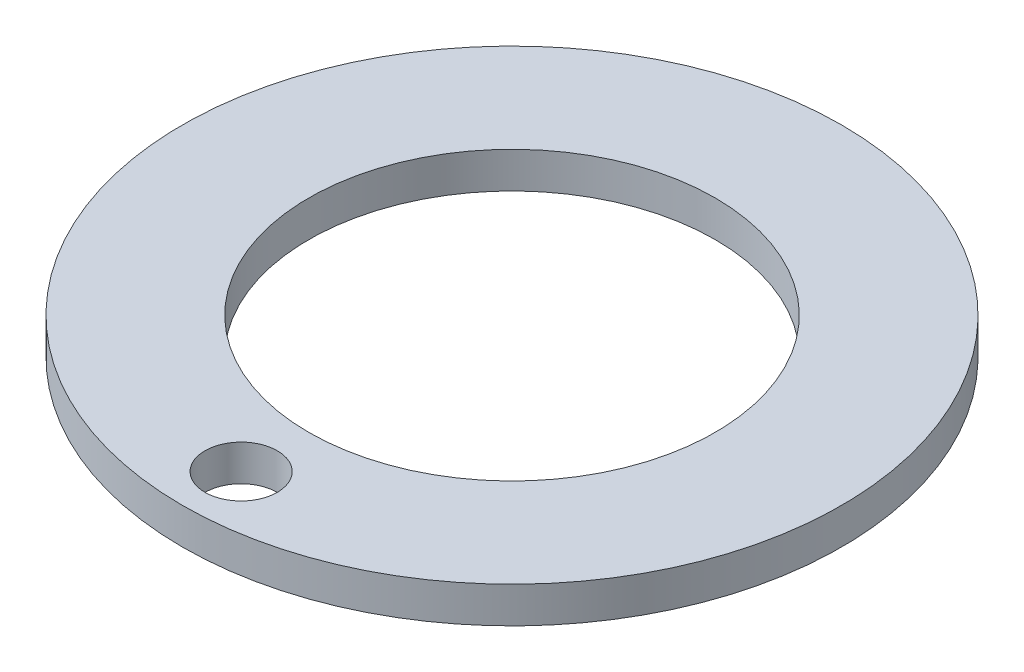
ISO-10303-21;
HEADER;
FILE_DESCRIPTION(('STEP AP214'),'2;1');
FILE_NAME('part.step','',(''),(''),'','','');
FILE_SCHEMA(('AUTOMOTIVE_DESIGN { 1 0 10303 214 1 1 1 1 }'));
ENDSEC;
DATA;
#1=APPLICATION_CONTEXT('core data for automotive mechanical design processes');
#2=APPLICATION_PROTOCOL_DEFINITION('international standard','automotive_design',2000,#1);
#3=PRODUCT_CONTEXT('',#1,'mechanical');
#4=PRODUCT('Part','Part','',(#3));
#5=PRODUCT_RELATED_PRODUCT_CATEGORY('part','',(#4));
#6=PRODUCT_DEFINITION_FORMATION('','',#4);
#7=PRODUCT_DEFINITION_CONTEXT('part definition',#1,'design');
#8=PRODUCT_DEFINITION('design','',#6,#7);
#9=PRODUCT_DEFINITION_SHAPE('','',#8);
#10=(LENGTH_UNIT() NAMED_UNIT(*) SI_UNIT(.MILLI.,.METRE.));
#11=(NAMED_UNIT(*) PLANE_ANGLE_UNIT() SI_UNIT($,.RADIAN.));
#12=(NAMED_UNIT(*) SI_UNIT($,.STERADIAN.) SOLID_ANGLE_UNIT());
#13=UNCERTAINTY_MEASURE_WITH_UNIT(LENGTH_MEASURE(1.E-05),#10,'distance_accuracy_value','');
#14=(GEOMETRIC_REPRESENTATION_CONTEXT(3) GLOBAL_UNCERTAINTY_ASSIGNED_CONTEXT((#13)) GLOBAL_UNIT_ASSIGNED_CONTEXT((#10,
#11,#12)) REPRESENTATION_CONTEXT('',''));
#15=CARTESIAN_POINT('',(0.,0.,0.));
#16=DIRECTION('',(0.,0.,1.));
#17=DIRECTION('',(1.,0.,0.));
#18=AXIS2_PLACEMENT_3D('',#15,#16,#17);
#19=CARTESIAN_POINT('',(0.,2.,0.085020242914978));
#20=DIRECTION('',(0.,1.,0.));
#21=DIRECTION('',(0.,0.,1.));
#22=AXIS2_PLACEMENT_3D('',#19,#20,#21);
#23=PLANE('',#22);
#24=CARTESIAN_POINT('',(0.,2.,0.085020242914978));
#25=DIRECTION('',(0.,1.,0.));
#26=DIRECTION('',(0.,0.,1.));
#27=AXIS2_PLACEMENT_3D('',#24,#25,#26);
#28=CIRCLE('',#27,11.25);
#29=CARTESIAN_POINT('',(0.,2.,11.335020242915));
#30=VERTEX_POINT('',#29);
#31=EDGE_CURVE('E54',#30,#30,#28,.T.);
#32=ORIENTED_EDGE('',*,*,#31,.F.);
#33=EDGE_LOOP('',(#32));
#34=FACE_BOUND('',#33,.T.);
#35=CARTESIAN_POINT('',(0.,2.,0.085020242914978));
#36=DIRECTION('',(0.,1.,0.));
#37=DIRECTION('',(0.,0.,1.));
#38=AXIS2_PLACEMENT_3D('',#35,#36,#37);
#39=CIRCLE('',#38,18.25);
#40=CARTESIAN_POINT('',(0.,2.,18.335020242915));
#41=VERTEX_POINT('',#40);
#42=EDGE_CURVE('E10',#41,#41,#39,.T.);
#43=ORIENTED_EDGE('',*,*,#42,.T.);
#44=EDGE_LOOP('',(#43));
#45=FACE_BOUND('',#44,.T.);
#46=CARTESIAN_POINT('',(0.,2.,15.085020242915));
#47=DIRECTION('',(0.,1.,0.));
#48=DIRECTION('',(0.,0.,1.));
#49=AXIS2_PLACEMENT_3D('',#46,#47,#48);
#50=CIRCLE('',#49,2.);
#51=CARTESIAN_POINT('',(0.,2.,17.085020242915));
#52=VERTEX_POINT('',#51);
#53=EDGE_CURVE('E60',#52,#52,#50,.T.);
#54=ORIENTED_EDGE('',*,*,#53,.F.);
#55=EDGE_LOOP('',(#54));
#56=FACE_BOUND('',#55,.T.);
#57=ADVANCED_FACE('F41',(#34,#45,#56),#23,.T.);
#58=CARTESIAN_POINT('',(0.,0.,0.085020242914978));
#59=DIRECTION('',(0.,1.,0.));
#60=DIRECTION('',(0.,0.,1.));
#61=AXIS2_PLACEMENT_3D('',#58,#59,#60);
#62=PLANE('',#61);
#63=CARTESIAN_POINT('',(0.,0.,0.085020242914978));
#64=DIRECTION('',(0.,1.,0.));
#65=DIRECTION('',(0.,0.,1.));
#66=AXIS2_PLACEMENT_3D('',#63,#64,#65);
#67=CIRCLE('',#66,18.25);
#68=CARTESIAN_POINT('',(0.,0.,18.335020242915));
#69=VERTEX_POINT('',#68);
#70=EDGE_CURVE('E45',#69,#69,#67,.T.);
#71=ORIENTED_EDGE('',*,*,#70,.F.);
#72=EDGE_LOOP('',(#71));
#73=FACE_BOUND('',#72,.T.);
#74=CARTESIAN_POINT('',(0.,0.,0.085020242914978));
#75=DIRECTION('',(0.,1.,0.));
#76=DIRECTION('',(0.,0.,1.));
#77=AXIS2_PLACEMENT_3D('',#74,#75,#76);
#78=CIRCLE('',#77,11.25);
#79=CARTESIAN_POINT('',(0.,0.,11.335020242915));
#80=VERTEX_POINT('',#79);
#81=EDGE_CURVE('E56',#80,#80,#78,.T.);
#82=ORIENTED_EDGE('',*,*,#81,.T.);
#83=EDGE_LOOP('',(#82));
#84=FACE_BOUND('',#83,.T.);
#85=CARTESIAN_POINT('',(0.,0.,15.085020242915));
#86=DIRECTION('',(0.,1.,0.));
#87=DIRECTION('',(0.,0.,1.));
#88=AXIS2_PLACEMENT_3D('',#85,#86,#87);
#89=CIRCLE('',#88,2.);
#90=CARTESIAN_POINT('',(0.,0.,17.085020242915));
#91=VERTEX_POINT('',#90);
#92=EDGE_CURVE('E64',#91,#91,#89,.T.);
#93=ORIENTED_EDGE('',*,*,#92,.T.);
#94=EDGE_LOOP('',(#93));
#95=FACE_BOUND('',#94,.T.);
#96=ADVANCED_FACE('F76',(#73,#84,#95),#62,.F.);
#97=CARTESIAN_POINT('',(0.,2.,0.085020242914978));
#98=DIRECTION('',(0.,-1.,0.));
#99=DIRECTION('',(0.,0.,-1.));
#100=AXIS2_PLACEMENT_3D('',#97,#98,#99);
#101=CYLINDRICAL_SURFACE('',#100,18.25);
#102=ORIENTED_EDGE('',*,*,#42,.F.);
#103=EDGE_LOOP('',(#102));
#104=FACE_BOUND('',#103,.T.);
#105=ORIENTED_EDGE('',*,*,#70,.T.);
#106=EDGE_LOOP('',(#105));
#107=FACE_BOUND('',#106,.T.);
#108=ADVANCED_FACE('F43',(#104,#107),#101,.T.);
#109=CARTESIAN_POINT('',(0.,2.,0.085020242914978));
#110=DIRECTION('',(0.,-1.,0.));
#111=DIRECTION('',(0.,0.,-1.));
#112=AXIS2_PLACEMENT_3D('',#109,#110,#111);
#113=CYLINDRICAL_SURFACE('',#112,11.25);
#114=ORIENTED_EDGE('',*,*,#31,.T.);
#115=EDGE_LOOP('',(#114));
#116=FACE_BOUND('',#115,.T.);
#117=ORIENTED_EDGE('',*,*,#81,.F.);
#118=EDGE_LOOP('',(#117));
#119=FACE_BOUND('',#118,.T.);
#120=ADVANCED_FACE('F85',(#116,#119),#113,.F.);
#121=CARTESIAN_POINT('',(0.,2.,15.085020242915));
#122=DIRECTION('',(0.,-1.,0.));
#123=DIRECTION('',(0.,0.,-1.));
#124=AXIS2_PLACEMENT_3D('',#121,#122,#123);
#125=CYLINDRICAL_SURFACE('',#124,2.);
#126=ORIENTED_EDGE('',*,*,#53,.T.);
#127=EDGE_LOOP('',(#126));
#128=FACE_BOUND('',#127,.T.);
#129=ORIENTED_EDGE('',*,*,#92,.F.);
#130=EDGE_LOOP('',(#129));
#131=FACE_BOUND('',#130,.T.);
#132=ADVANCED_FACE('F72',(#128,#131),#125,.F.);
#133=CLOSED_SHELL('',(#57,#96,#108,#120,#132));
#134=MANIFOLD_SOLID_BREP('B2',#133);
#135=ADVANCED_BREP_SHAPE_REPRESENTATION('',(#18,#134),#14);
#136=SHAPE_DEFINITION_REPRESENTATION(#9,#135);
ENDSEC;
END-ISO-10303-21;
